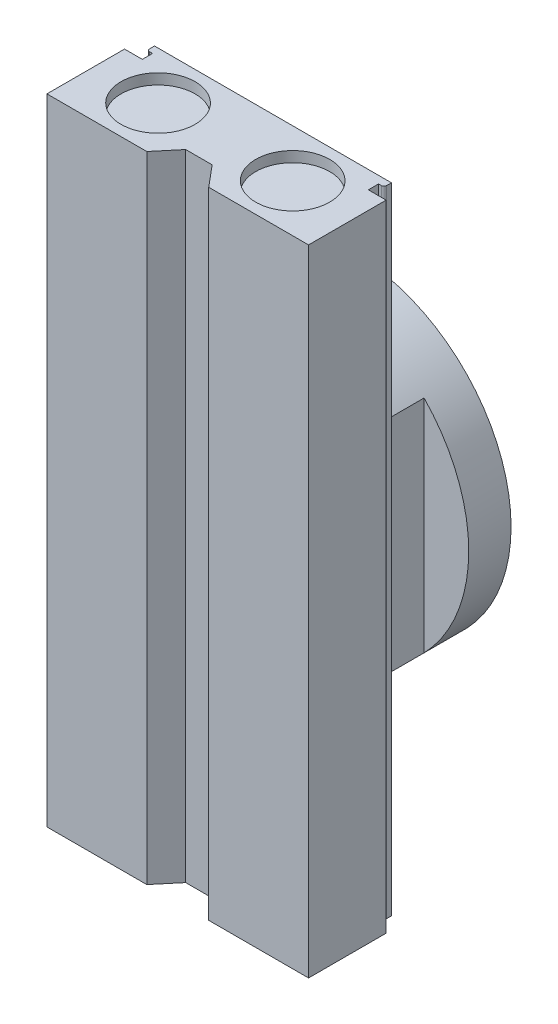
ISO-10303-21;
HEADER;
FILE_DESCRIPTION(('STEP AP214'),'2;1');
FILE_NAME('part.step','',(''),(''),'','','');
FILE_SCHEMA(('AUTOMOTIVE_DESIGN { 1 0 10303 214 1 1 1 1 }'));
ENDSEC;
DATA;
#1=APPLICATION_CONTEXT('core data for automotive mechanical design processes');
#2=APPLICATION_PROTOCOL_DEFINITION('international standard','automotive_design',2000,#1);
#3=PRODUCT_CONTEXT('',#1,'mechanical');
#4=PRODUCT('Part','Part','',(#3));
#5=PRODUCT_RELATED_PRODUCT_CATEGORY('part','',(#4));
#6=PRODUCT_DEFINITION_FORMATION('','',#4);
#7=PRODUCT_DEFINITION_CONTEXT('part definition',#1,'design');
#8=PRODUCT_DEFINITION('design','',#6,#7);
#9=PRODUCT_DEFINITION_SHAPE('','',#8);
#10=(LENGTH_UNIT() NAMED_UNIT(*) SI_UNIT(.MILLI.,.METRE.));
#11=(NAMED_UNIT(*) PLANE_ANGLE_UNIT() SI_UNIT($,.RADIAN.));
#12=(NAMED_UNIT(*) SI_UNIT($,.STERADIAN.) SOLID_ANGLE_UNIT());
#13=UNCERTAINTY_MEASURE_WITH_UNIT(LENGTH_MEASURE(1.E-05),#10,'distance_accuracy_value','');
#14=(GEOMETRIC_REPRESENTATION_CONTEXT(3) GLOBAL_UNCERTAINTY_ASSIGNED_CONTEXT((#13)) GLOBAL_UNIT_ASSIGNED_CONTEXT((#10,
#11,#12)) REPRESENTATION_CONTEXT('',''));
#15=CARTESIAN_POINT('',(0.,0.,0.));
#16=DIRECTION('',(0.,0.,1.));
#17=DIRECTION('',(1.,0.,0.));
#18=AXIS2_PLACEMENT_3D('',#15,#16,#17);
#19=CARTESIAN_POINT('',(-24.7249393998215,60.,33.));
#20=DIRECTION('',(0.,0.,1.));
#21=DIRECTION('',(1.,0.,0.));
#22=AXIS2_PLACEMENT_3D('',#19,#20,#21);
#23=PLANE('',#22);
#24=DIRECTION('',(0.,1.,0.));
#25=VECTOR('',#24,1.);
#26=CARTESIAN_POINT('',(-5.85639852470913,60.,33.));
#27=LINE('',#26,#25);
#28=CARTESIAN_POINT('',(-5.85639852470913,60.,33.));
#29=VERTEX_POINT('',#28);
#30=CARTESIAN_POINT('',(-5.85639852470913,-60.,33.));
#31=VERTEX_POINT('',#30);
#32=EDGE_CURVE('E184',#29,#31,#27,.F.);
#33=ORIENTED_EDGE('',*,*,#32,.F.);
#34=DIRECTION('',(-1.,0.,0.));
#35=VECTOR('',#34,1.);
#36=CARTESIAN_POINT('',(24.7249393998215,60.,33.));
#37=LINE('',#36,#35);
#38=CARTESIAN_POINT('',(-24.7249393998215,60.,33.));
#39=VERTEX_POINT('',#38);
#40=EDGE_CURVE('E326',#29,#39,#37,.T.);
#41=ORIENTED_EDGE('',*,*,#40,.T.);
#42=DIRECTION('',(0.,-1.,0.));
#43=VECTOR('',#42,1.);
#44=CARTESIAN_POINT('',(-24.7249393998215,-60.,33.));
#45=LINE('',#44,#43);
#46=CARTESIAN_POINT('',(-24.7249393998215,-60.,33.));
#47=VERTEX_POINT('',#46);
#48=EDGE_CURVE('E317',#39,#47,#45,.T.);
#49=ORIENTED_EDGE('',*,*,#48,.T.);
#50=DIRECTION('',(1.,0.,0.));
#51=VECTOR('',#50,1.);
#52=CARTESIAN_POINT('',(24.7249393998215,-60.,33.));
#53=LINE('',#52,#51);
#54=EDGE_CURVE('E322',#47,#31,#53,.T.);
#55=ORIENTED_EDGE('',*,*,#54,.T.);
#56=EDGE_LOOP('',(#33,#41,#49,#55));
#57=FACE_BOUND('',#56,.T.);
#58=ADVANCED_FACE('F32',(#57),#23,.T.);
#59=CARTESIAN_POINT('',(0.,0.,0.));
#60=DIRECTION('',(0.,0.,1.));
#61=DIRECTION('',(1.,0.,0.));
#62=AXIS2_PLACEMENT_3D('',#59,#60,#61);
#63=PLANE('',#62);
#64=CARTESIAN_POINT('',(0.,0.,0.));
#65=DIRECTION('',(0.,0.,1.));
#66=DIRECTION('',(1.,0.,0.));
#67=AXIS2_PLACEMENT_3D('',#64,#65,#66);
#68=CIRCLE('',#67,30.);
#69=CARTESIAN_POINT('',(30.,0.,0.));
#70=VERTEX_POINT('',#69);
#71=EDGE_CURVE('E363',#70,#70,#68,.T.);
#72=ORIENTED_EDGE('',*,*,#71,.F.);
#73=EDGE_LOOP('',(#72));
#74=FACE_BOUND('',#73,.T.);
#75=CARTESIAN_POINT('',(0.,0.,0.));
#76=DIRECTION('',(0.,0.,1.));
#77=DIRECTION('',(1.,0.,0.));
#78=AXIS2_PLACEMENT_3D('',#75,#76,#77);
#79=CIRCLE('',#78,10.);
#80=CARTESIAN_POINT('',(10.,0.,0.));
#81=VERTEX_POINT('',#80);
#82=EDGE_CURVE('E11',#81,#81,#79,.F.);
#83=ORIENTED_EDGE('',*,*,#82,.F.);
#84=EDGE_LOOP('',(#83));
#85=FACE_BOUND('',#84,.T.);
#86=ADVANCED_FACE('F448',(#74,#85),#63,.F.);
#87=CARTESIAN_POINT('',(24.7249393998215,60.,33.));
#88=DIRECTION('',(0.,-1.,0.));
#89=DIRECTION('',(1.,0.,0.));
#90=AXIS2_PLACEMENT_3D('',#87,#88,#89);
#91=PLANE('',#90);
#92=ORIENTED_EDGE('',*,*,#40,.F.);
#93=DIRECTION('',(0.64278760968654,0.,-0.766044443118977));
#94=VECTOR('',#93,1.);
#95=CARTESIAN_POINT('',(-2.50000000000001,60.,29.));
#96=LINE('',#95,#94);
#97=CARTESIAN_POINT('',(-2.5,60.,29.));
#98=VERTEX_POINT('',#97);
#99=EDGE_CURVE('E210',#98,#29,#96,.F.);
#100=ORIENTED_EDGE('',*,*,#99,.F.);
#101=DIRECTION('',(-1.,0.,0.));
#102=VECTOR('',#101,1.);
#103=CARTESIAN_POINT('',(2.5,60.,29.));
#104=LINE('',#103,#102);
#105=CARTESIAN_POINT('',(2.5,60.,29.));
#106=VERTEX_POINT('',#105);
#107=EDGE_CURVE('E188',#106,#98,#104,.T.);
#108=ORIENTED_EDGE('',*,*,#107,.F.);
#109=DIRECTION('',(-0.64278760968654,0.,-0.766044443118977));
#110=VECTOR('',#109,1.);
#111=CARTESIAN_POINT('',(13.6524250931667,60.,42.2909426709192));
#112=LINE('',#111,#110);
#113=CARTESIAN_POINT('',(5.85639852470913,60.,33.));
#114=VERTEX_POINT('',#113);
#115=EDGE_CURVE('E36',#106,#114,#112,.F.);
#116=ORIENTED_EDGE('',*,*,#115,.T.);
#117=CARTESIAN_POINT('',(24.7249393998215,60.,33.));
#118=VERTEX_POINT('',#117);
#119=EDGE_CURVE('E327',#118,#114,#37,.T.);
#120=ORIENTED_EDGE('',*,*,#119,.F.);
#121=DIRECTION('',(0.,0.,-1.));
#122=VECTOR('',#121,1.);
#123=CARTESIAN_POINT('',(24.7249393998215,60.,33.));
#124=LINE('',#123,#122);
#125=CARTESIAN_POINT('',(24.7249393998215,60.,18.3357840802705));
#126=VERTEX_POINT('',#125);
#127=EDGE_CURVE('E336',#118,#126,#124,.T.);
#128=ORIENTED_EDGE('',*,*,#127,.T.);
#129=DIRECTION('',(-1.,0.,0.));
#130=VECTOR('',#129,1.);
#131=CARTESIAN_POINT('',(24.7249393998215,60.,18.3357840802705));
#132=LINE('',#131,#130);
#133=CARTESIAN_POINT('',(21.3562483247727,60.,18.3357840802705));
#134=VERTEX_POINT('',#133);
#135=EDGE_CURVE('E252',#126,#134,#132,.T.);
#136=ORIENTED_EDGE('',*,*,#135,.T.);
#137=DIRECTION('',(0.,0.,-1.));
#138=VECTOR('',#137,1.);
#139=CARTESIAN_POINT('',(21.3562483247727,60.,18.3357840802705));
#140=LINE('',#139,#138);
#141=CARTESIAN_POINT('',(21.3562483247727,60.,16.4103549355981));
#142=VERTEX_POINT('',#141);
#143=EDGE_CURVE('E255',#134,#142,#140,.T.);
#144=ORIENTED_EDGE('',*,*,#143,.T.);
#145=DIRECTION('',(1.,0.,0.));
#146=VECTOR('',#145,1.);
#147=CARTESIAN_POINT('',(21.3562483247727,60.,16.4103549355981));
#148=LINE('',#147,#146);
#149=CARTESIAN_POINT('',(21.8895771507805,60.,16.4103549355981));
#150=VERTEX_POINT('',#149);
#151=EDGE_CURVE('E259',#142,#150,#148,.T.);
#152=ORIENTED_EDGE('',*,*,#151,.T.);
#153=CARTESIAN_POINT('',(21.8895771507805,60.,15.9103549355981));
#154=DIRECTION('',(0.,1.,0.));
#155=DIRECTION('',(0.,0.,-1.));
#156=AXIS2_PLACEMENT_3D('',#153,#154,#155);
#157=CIRCLE('',#156,0.5);
#158=CARTESIAN_POINT('',(22.3895771507805,60.,15.9103549355981));
#159=VERTEX_POINT('',#158);
#160=EDGE_CURVE('E262',#150,#159,#157,.T.);
#161=ORIENTED_EDGE('',*,*,#160,.T.);
#162=DIRECTION('',(0.,0.,-1.));
#163=VECTOR('',#162,1.);
#164=CARTESIAN_POINT('',(22.3895771507805,60.,15.9103549355981));
#165=LINE('',#164,#163);
#166=CARTESIAN_POINT('',(22.3895771507805,60.,15.));
#167=VERTEX_POINT('',#166);
#168=EDGE_CURVE('E265',#159,#167,#165,.T.);
#169=ORIENTED_EDGE('',*,*,#168,.T.);
#170=DIRECTION('',(-1.,0.,0.));
#171=VECTOR('',#170,1.);
#172=CARTESIAN_POINT('',(24.7249393998215,60.,15.));
#173=LINE('',#172,#171);
#174=CARTESIAN_POINT('',(-22.3895771507805,60.,15.));
#175=VERTEX_POINT('',#174);
#176=EDGE_CURVE('E321',#167,#175,#173,.T.);
#177=ORIENTED_EDGE('',*,*,#176,.T.);
#178=DIRECTION('',(0.,0.,1.));
#179=VECTOR('',#178,1.);
#180=CARTESIAN_POINT('',(-22.3895771507805,60.,13.7574931850115));
#181=LINE('',#180,#179);
#182=CARTESIAN_POINT('',(-22.3895771507805,60.,15.9103549355981));
#183=VERTEX_POINT('',#182);
#184=EDGE_CURVE('E224',#175,#183,#181,.T.);
#185=ORIENTED_EDGE('',*,*,#184,.T.);
#186=CARTESIAN_POINT('',(-21.8895771507805,60.,15.9103549355981));
#187=DIRECTION('',(0.,1.,0.));
#188=DIRECTION('',(0.,0.,1.));
#189=AXIS2_PLACEMENT_3D('',#186,#187,#188);
#190=CIRCLE('',#189,0.5);
#191=CARTESIAN_POINT('',(-21.8895771507805,60.,16.4103549355981));
#192=VERTEX_POINT('',#191);
#193=EDGE_CURVE('E211',#183,#192,#190,.T.);
#194=ORIENTED_EDGE('',*,*,#193,.T.);
#195=DIRECTION('',(1.,0.,0.));
#196=VECTOR('',#195,1.);
#197=CARTESIAN_POINT('',(-21.3562483247727,60.,16.4103549355982));
#198=LINE('',#197,#196);
#199=CARTESIAN_POINT('',(-21.3562483247727,60.,16.4103549355982));
#200=VERTEX_POINT('',#199);
#201=EDGE_CURVE('E214',#192,#200,#198,.T.);
#202=ORIENTED_EDGE('',*,*,#201,.T.);
#203=DIRECTION('',(0.,0.,1.));
#204=VECTOR('',#203,1.);
#205=CARTESIAN_POINT('',(-21.3562483247727,60.,18.3357840802706));
#206=LINE('',#205,#204);
#207=CARTESIAN_POINT('',(-21.3562483247727,60.,18.3357840802706));
#208=VERTEX_POINT('',#207);
#209=EDGE_CURVE('E218',#200,#208,#206,.T.);
#210=ORIENTED_EDGE('',*,*,#209,.T.);
#211=DIRECTION('',(-1.,0.,0.));
#212=VECTOR('',#211,1.);
#213=CARTESIAN_POINT('',(-24.7249393998216,60.,18.3357840802706));
#214=LINE('',#213,#212);
#215=CARTESIAN_POINT('',(-24.7249393998215,60.,18.3357840802706));
#216=VERTEX_POINT('',#215);
#217=EDGE_CURVE('E221',#208,#216,#214,.T.);
#218=ORIENTED_EDGE('',*,*,#217,.T.);
#219=DIRECTION('',(0.,0.,-1.));
#220=VECTOR('',#219,1.);
#221=CARTESIAN_POINT('',(-24.7249393998215,60.,33.));
#222=LINE('',#221,#220);
#223=EDGE_CURVE('E330',#39,#216,#222,.T.);
#224=ORIENTED_EDGE('',*,*,#223,.F.);
#225=EDGE_LOOP('',(#92,#100,#108,#116,#120,#128,#136,#144,#152,#161,#169,#177,#185,#194,#202,
#210,#218,#224));
#226=FACE_BOUND('',#225,.T.);
#227=CARTESIAN_POINT('',(12.7249393998215,60.,24.));
#228=DIRECTION('',(0.,-1.,0.));
#229=DIRECTION('',(0.,0.,-1.));
#230=AXIS2_PLACEMENT_3D('',#227,#228,#229);
#231=CIRCLE('',#230,7.);
#232=CARTESIAN_POINT('',(12.7249393998215,60.,17.));
#233=VERTEX_POINT('',#232);
#234=EDGE_CURVE('E296',#233,#233,#231,.T.);
#235=ORIENTED_EDGE('',*,*,#234,.T.);
#236=EDGE_LOOP('',(#235));
#237=FACE_BOUND('',#236,.T.);
#238=CARTESIAN_POINT('',(-12.7249393998215,60.,24.));
#239=DIRECTION('',(0.,-1.,0.));
#240=DIRECTION('',(0.,0.,-1.));
#241=AXIS2_PLACEMENT_3D('',#238,#239,#240);
#242=CIRCLE('',#241,7.);
#243=CARTESIAN_POINT('',(-12.7249393998215,60.,17.));
#244=VERTEX_POINT('',#243);
#245=EDGE_CURVE('E284',#244,#244,#242,.T.);
#246=ORIENTED_EDGE('',*,*,#245,.T.);
#247=EDGE_LOOP('',(#246));
#248=FACE_BOUND('',#247,.T.);
#249=ADVANCED_FACE('F390',(#226,#237,#248),#91,.F.);
#250=CARTESIAN_POINT('',(0.,0.,15.));
#251=DIRECTION('',(0.,0.,-1.));
#252=DIRECTION('',(-1.,0.,0.));
#253=AXIS2_PLACEMENT_3D('',#250,#251,#252);
#254=CYLINDRICAL_SURFACE('',#253,30.);
#255=CARTESIAN_POINT('',(0.,0.,15.));
#256=DIRECTION('',(0.,0.,1.));
#257=DIRECTION('',(1.,0.,0.));
#258=AXIS2_PLACEMENT_3D('',#255,#256,#257);
#259=CIRCLE('',#258,30.);
#260=CARTESIAN_POINT('',(-21.5599763803757,-20.8606667793156,15.));
#261=VERTEX_POINT('',#260);
#262=CARTESIAN_POINT('',(21.5599763803757,-20.8606667793156,15.));
#263=VERTEX_POINT('',#262);
#264=EDGE_CURVE('E367',#261,#263,#259,.T.);
#265=ORIENTED_EDGE('',*,*,#264,.F.);
#266=DIRECTION('',(0.,0.,-1.));
#267=VECTOR('',#266,1.);
#268=CARTESIAN_POINT('',(-21.5599763803757,-20.8606667793156,15.));
#269=LINE('',#268,#267);
#270=CARTESIAN_POINT('',(-21.5599763803757,-20.8606667793156,8.));
#271=VERTEX_POINT('',#270);
#272=EDGE_CURVE('E351',#261,#271,#269,.T.);
#273=ORIENTED_EDGE('',*,*,#272,.T.);
#274=CARTESIAN_POINT('',(0.,0.,8.));
#275=DIRECTION('',(0.,0.,1.));
#276=DIRECTION('',(1.,0.,0.));
#277=AXIS2_PLACEMENT_3D('',#274,#275,#276);
#278=CIRCLE('',#277,30.);
#279=CARTESIAN_POINT('',(-21.5599763803757,20.8606667793156,8.));
#280=VERTEX_POINT('',#279);
#281=EDGE_CURVE('E377',#280,#271,#278,.T.);
#282=ORIENTED_EDGE('',*,*,#281,.F.);
#283=DIRECTION('',(0.,0.,-1.));
#284=VECTOR('',#283,1.);
#285=CARTESIAN_POINT('',(-21.5599763803757,20.8606667793156,15.));
#286=LINE('',#285,#284);
#287=CARTESIAN_POINT('',(-21.5599763803757,20.8606667793156,15.));
#288=VERTEX_POINT('',#287);
#289=EDGE_CURVE('E348',#280,#288,#286,.F.);
#290=ORIENTED_EDGE('',*,*,#289,.T.);
#291=CARTESIAN_POINT('',(21.5599763803757,20.8606667793156,15.));
#292=VERTEX_POINT('',#291);
#293=EDGE_CURVE('E364',#292,#288,#259,.T.);
#294=ORIENTED_EDGE('',*,*,#293,.F.);
#295=DIRECTION('',(0.,0.,-1.));
#296=VECTOR('',#295,1.);
#297=CARTESIAN_POINT('',(21.5599763803757,20.8606667793156,15.));
#298=LINE('',#297,#296);
#299=CARTESIAN_POINT('',(21.5599763803757,20.8606667793156,8.));
#300=VERTEX_POINT('',#299);
#301=EDGE_CURVE('E360',#292,#300,#298,.T.);
#302=ORIENTED_EDGE('',*,*,#301,.T.);
#303=CARTESIAN_POINT('',(0.,0.,8.));
#304=DIRECTION('',(0.,0.,1.));
#305=DIRECTION('',(1.,0.,0.));
#306=AXIS2_PLACEMENT_3D('',#303,#304,#305);
#307=CIRCLE('',#306,30.);
#308=CARTESIAN_POINT('',(21.5599763803757,-20.8606667793156,8.));
#309=VERTEX_POINT('',#308);
#310=EDGE_CURVE('E372',#309,#300,#307,.T.);
#311=ORIENTED_EDGE('',*,*,#310,.F.);
#312=DIRECTION('',(0.,0.,-1.));
#313=VECTOR('',#312,1.);
#314=CARTESIAN_POINT('',(21.5599763803757,-20.8606667793156,15.));
#315=LINE('',#314,#313);
#316=EDGE_CURVE('E357',#309,#263,#315,.F.);
#317=ORIENTED_EDGE('',*,*,#316,.T.);
#318=EDGE_LOOP('',(#265,#273,#282,#290,#294,#302,#311,#317));
#319=FACE_BOUND('',#318,.T.);
#320=ORIENTED_EDGE('',*,*,#71,.T.);
#321=EDGE_LOOP('',(#320));
#322=FACE_BOUND('',#321,.T.);
#323=ADVANCED_FACE('F487',(#319,#322),#254,.T.);
#324=CARTESIAN_POINT('',(21.5599763803757,-26.8777185439,8.));
#325=DIRECTION('',(0.,0.,1.));
#326=DIRECTION('',(1.,0.,0.));
#327=AXIS2_PLACEMENT_3D('',#324,#325,#326);
#328=PLANE('',#327);
#329=ORIENTED_EDGE('',*,*,#310,.T.);
#330=DIRECTION('',(0.,-1.,0.));
#331=VECTOR('',#330,1.);
#332=CARTESIAN_POINT('',(21.5599763803757,26.1841000008317,8.));
#333=LINE('',#332,#331);
#334=EDGE_CURVE('E354',#300,#309,#333,.T.);
#335=ORIENTED_EDGE('',*,*,#334,.T.);
#336=EDGE_LOOP('',(#329,#335));
#337=FACE_BOUND('',#336,.T.);
#338=ADVANCED_FACE('F484',(#337),#328,.T.);
#339=CARTESIAN_POINT('',(21.5599763803757,26.1841000008317,8.));
#340=DIRECTION('',(-1.,0.,0.));
#341=DIRECTION('',(0.,-1.,0.));
#342=AXIS2_PLACEMENT_3D('',#339,#340,#341);
#343=PLANE('',#342);
#344=DIRECTION('',(0.,-1.,0.));
#345=VECTOR('',#344,1.);
#346=CARTESIAN_POINT('',(21.5599763803757,0.,15.));
#347=LINE('',#346,#345);
#348=EDGE_CURVE('E366',#292,#263,#347,.T.);
#349=ORIENTED_EDGE('',*,*,#348,.T.);
#350=ORIENTED_EDGE('',*,*,#316,.F.);
#351=ORIENTED_EDGE('',*,*,#334,.F.);
#352=ORIENTED_EDGE('',*,*,#301,.F.);
#353=EDGE_LOOP('',(#349,#350,#351,#352));
#354=FACE_BOUND('',#353,.T.);
#355=ADVANCED_FACE('F479',(#354),#343,.F.);
#356=CARTESIAN_POINT('',(-30.9008162630705,26.1841000008317,8.));
#357=DIRECTION('',(0.,0.,1.));
#358=DIRECTION('',(1.,0.,0.));
#359=AXIS2_PLACEMENT_3D('',#356,#357,#358);
#360=PLANE('',#359);
#361=ORIENTED_EDGE('',*,*,#281,.T.);
#362=DIRECTION('',(0.,1.,0.));
#363=VECTOR('',#362,1.);
#364=CARTESIAN_POINT('',(-21.5599763803757,26.1841000008317,8.));
#365=LINE('',#364,#363);
#366=EDGE_CURVE('E345',#271,#280,#365,.T.);
#367=ORIENTED_EDGE('',*,*,#366,.T.);
#368=EDGE_LOOP('',(#361,#367));
#369=FACE_BOUND('',#368,.T.);
#370=ADVANCED_FACE('F475',(#369),#360,.T.);
#371=CARTESIAN_POINT('',(-21.5599763803757,26.1841000008317,8.));
#372=DIRECTION('',(1.,0.,0.));
#373=DIRECTION('',(0.,1.,0.));
#374=AXIS2_PLACEMENT_3D('',#371,#372,#373);
#375=PLANE('',#374);
#376=DIRECTION('',(0.,1.,0.));
#377=VECTOR('',#376,1.);
#378=CARTESIAN_POINT('',(-21.5599763803757,0.,15.));
#379=LINE('',#378,#377);
#380=EDGE_CURVE('E374',#261,#288,#379,.T.);
#381=ORIENTED_EDGE('',*,*,#380,.T.);
#382=ORIENTED_EDGE('',*,*,#289,.F.);
#383=ORIENTED_EDGE('',*,*,#366,.F.);
#384=ORIENTED_EDGE('',*,*,#272,.F.);
#385=EDGE_LOOP('',(#381,#382,#383,#384));
#386=FACE_BOUND('',#385,.T.);
#387=ADVANCED_FACE('F478',(#386),#375,.F.);
#388=CARTESIAN_POINT('',(-24.7249393998215,60.,15.));
#389=DIRECTION('',(0.,0.,1.));
#390=DIRECTION('',(1.,0.,0.));
#391=AXIS2_PLACEMENT_3D('',#388,#389,#390);
#392=PLANE('',#391);
#393=DIRECTION('',(1.,0.,0.));
#394=VECTOR('',#393,1.);
#395=CARTESIAN_POINT('',(24.7249393998215,-60.,15.));
#396=LINE('',#395,#394);
#397=CARTESIAN_POINT('',(-22.3895771507805,-60.,15.));
#398=VERTEX_POINT('',#397);
#399=CARTESIAN_POINT('',(22.3895771507805,-60.,15.));
#400=VERTEX_POINT('',#399);
#401=EDGE_CURVE('E314',#398,#400,#396,.T.);
#402=ORIENTED_EDGE('',*,*,#401,.F.);
#403=DIRECTION('',(0.,1.,0.));
#404=VECTOR('',#403,1.);
#405=CARTESIAN_POINT('',(-22.3895771507805,60.,15.));
#406=LINE('',#405,#404);
#407=EDGE_CURVE('E248',#398,#175,#406,.T.);
#408=ORIENTED_EDGE('',*,*,#407,.T.);
#409=ORIENTED_EDGE('',*,*,#176,.F.);
#410=DIRECTION('',(0.,-1.,0.));
#411=VECTOR('',#410,1.);
#412=CARTESIAN_POINT('',(22.3895771507805,60.,15.));
#413=LINE('',#412,#411);
#414=EDGE_CURVE('E281',#167,#400,#413,.T.);
#415=ORIENTED_EDGE('',*,*,#414,.T.);
#416=EDGE_LOOP('',(#402,#408,#409,#415));
#417=FACE_BOUND('',#416,.T.);
#418=ORIENTED_EDGE('',*,*,#264,.T.);
#419=ORIENTED_EDGE('',*,*,#348,.F.);
#420=ORIENTED_EDGE('',*,*,#293,.T.);
#421=ORIENTED_EDGE('',*,*,#380,.F.);
#422=EDGE_LOOP('',(#418,#419,#420,#421));
#423=FACE_BOUND('',#422,.T.);
#424=ADVANCED_FACE('F421',(#417,#423),#392,.F.);
#425=CARTESIAN_POINT('',(-24.7249393998215,-60.,33.));
#426=DIRECTION('',(1.,0.,0.));
#427=DIRECTION('',(0.,1.,0.));
#428=AXIS2_PLACEMENT_3D('',#425,#426,#427);
#429=PLANE('',#428);
#430=ORIENTED_EDGE('',*,*,#223,.T.);
#431=DIRECTION('',(0.,-1.,0.));
#432=VECTOR('',#431,1.);
#433=CARTESIAN_POINT('',(-24.7249393998215,-60.,18.3357840802706));
#434=LINE('',#433,#432);
#435=CARTESIAN_POINT('',(-24.7249393998216,-60.,18.3357840802706));
#436=VERTEX_POINT('',#435);
#437=EDGE_CURVE('E239',#216,#436,#434,.T.);
#438=ORIENTED_EDGE('',*,*,#437,.T.);
#439=DIRECTION('',(0.,0.,-1.));
#440=VECTOR('',#439,1.);
#441=CARTESIAN_POINT('',(-24.7249393998215,-60.,33.));
#442=LINE('',#441,#440);
#443=EDGE_CURVE('E342',#47,#436,#442,.T.);
#444=ORIENTED_EDGE('',*,*,#443,.F.);
#445=ORIENTED_EDGE('',*,*,#48,.F.);
#446=EDGE_LOOP('',(#430,#438,#444,#445));
#447=FACE_BOUND('',#446,.T.);
#448=ADVANCED_FACE('F444',(#447),#429,.F.);
#449=CARTESIAN_POINT('',(24.7249393998215,-60.,33.));
#450=DIRECTION('',(0.,1.,0.));
#451=DIRECTION('',(-1.,0.,0.));
#452=AXIS2_PLACEMENT_3D('',#449,#450,#451);
#453=PLANE('',#452);
#454=CARTESIAN_POINT('',(-12.7249393998215,-60.,24.));
#455=DIRECTION('',(0.,-1.,0.));
#456=DIRECTION('',(0.,0.,-1.));
#457=AXIS2_PLACEMENT_3D('',#454,#455,#456);
#458=CIRCLE('',#457,7.);
#459=CARTESIAN_POINT('',(-12.7249393998215,-60.,17.));
#460=VERTEX_POINT('',#459);
#461=EDGE_CURVE('E302',#460,#460,#458,.T.);
#462=ORIENTED_EDGE('',*,*,#461,.F.);
#463=EDGE_LOOP('',(#462));
#464=FACE_BOUND('',#463,.T.);
#465=CARTESIAN_POINT('',(12.7249393998215,-60.,24.));
#466=DIRECTION('',(0.,-1.,0.));
#467=DIRECTION('',(0.,0.,-1.));
#468=AXIS2_PLACEMENT_3D('',#465,#466,#467);
#469=CIRCLE('',#468,7.);
#470=CARTESIAN_POINT('',(12.7249393998215,-60.,17.));
#471=VERTEX_POINT('',#470);
#472=EDGE_CURVE('E308',#471,#471,#469,.T.);
#473=ORIENTED_EDGE('',*,*,#472,.F.);
#474=EDGE_LOOP('',(#473));
#475=FACE_BOUND('',#474,.T.);
#476=DIRECTION('',(1.,0.,0.));
#477=VECTOR('',#476,1.);
#478=CARTESIAN_POINT('',(2.5,-60.,29.));
#479=LINE('',#478,#477);
#480=CARTESIAN_POINT('',(-2.5,-60.,29.));
#481=VERTEX_POINT('',#480);
#482=CARTESIAN_POINT('',(2.5,-60.,29.));
#483=VERTEX_POINT('',#482);
#484=EDGE_CURVE('E194',#481,#483,#479,.T.);
#485=ORIENTED_EDGE('',*,*,#484,.F.);
#486=DIRECTION('',(0.64278760968654,0.,-0.766044443118977));
#487=VECTOR('',#486,1.);
#488=CARTESIAN_POINT('',(6.77907363695058,-60.,17.941630657218));
#489=LINE('',#488,#487);
#490=EDGE_CURVE('E178',#481,#31,#489,.F.);
#491=ORIENTED_EDGE('',*,*,#490,.T.);
#492=ORIENTED_EDGE('',*,*,#54,.F.);
#493=ORIENTED_EDGE('',*,*,#443,.T.);
#494=DIRECTION('',(-1.,0.,0.));
#495=VECTOR('',#494,1.);
#496=CARTESIAN_POINT('',(-24.7249393998216,-60.,18.3357840802706));
#497=LINE('',#496,#495);
#498=CARTESIAN_POINT('',(-21.3562483247727,-60.,18.3357840802706));
#499=VERTEX_POINT('',#498);
#500=EDGE_CURVE('E215',#499,#436,#497,.T.);
#501=ORIENTED_EDGE('',*,*,#500,.F.);
#502=DIRECTION('',(0.,0.,1.));
#503=VECTOR('',#502,1.);
#504=CARTESIAN_POINT('',(-21.3562483247727,-60.,18.3357840802706));
#505=LINE('',#504,#503);
#506=CARTESIAN_POINT('',(-21.3562483247727,-60.,16.4103549355982));
#507=VERTEX_POINT('',#506);
#508=EDGE_CURVE('E232',#507,#499,#505,.T.);
#509=ORIENTED_EDGE('',*,*,#508,.F.);
#510=DIRECTION('',(1.,0.,0.));
#511=VECTOR('',#510,1.);
#512=CARTESIAN_POINT('',(-21.3562483247727,-60.,16.4103549355982));
#513=LINE('',#512,#511);
#514=CARTESIAN_POINT('',(-21.8895771507805,-60.,16.4103549355981));
#515=VERTEX_POINT('',#514);
#516=EDGE_CURVE('E229',#515,#507,#513,.T.);
#517=ORIENTED_EDGE('',*,*,#516,.F.);
#518=CARTESIAN_POINT('',(-21.8895771507805,-60.,15.9103549355981));
#519=DIRECTION('',(0.,1.,0.));
#520=DIRECTION('',(0.,0.,1.));
#521=AXIS2_PLACEMENT_3D('',#518,#519,#520);
#522=CIRCLE('',#521,0.5);
#523=CARTESIAN_POINT('',(-22.3895771507805,-60.,15.9103549355981));
#524=VERTEX_POINT('',#523);
#525=EDGE_CURVE('E209',#524,#515,#522,.T.);
#526=ORIENTED_EDGE('',*,*,#525,.F.);
#527=DIRECTION('',(0.,0.,-1.));
#528=VECTOR('',#527,1.);
#529=CARTESIAN_POINT('',(-22.3895771507805,-60.,33.));
#530=LINE('',#529,#528);
#531=EDGE_CURVE('E42',#524,#398,#530,.T.);
#532=ORIENTED_EDGE('',*,*,#531,.T.);
#533=ORIENTED_EDGE('',*,*,#401,.T.);
#534=DIRECTION('',(0.,0.,-1.));
#535=VECTOR('',#534,1.);
#536=CARTESIAN_POINT('',(22.3895771507805,-60.,15.9103549355981));
#537=LINE('',#536,#535);
#538=CARTESIAN_POINT('',(22.3895771507805,-60.,15.9103549355981));
#539=VERTEX_POINT('',#538);
#540=EDGE_CURVE('E256',#539,#400,#537,.T.);
#541=ORIENTED_EDGE('',*,*,#540,.F.);
#542=CARTESIAN_POINT('',(21.8895771507805,-60.,15.9103549355981));
#543=DIRECTION('',(0.,1.,0.));
#544=DIRECTION('',(0.,0.,-1.));
#545=AXIS2_PLACEMENT_3D('',#542,#543,#544);
#546=CIRCLE('',#545,0.5);
#547=CARTESIAN_POINT('',(21.8895771507805,-60.,16.4103549355981));
#548=VERTEX_POINT('',#547);
#549=EDGE_CURVE('E276',#548,#539,#546,.T.);
#550=ORIENTED_EDGE('',*,*,#549,.F.);
#551=DIRECTION('',(1.,0.,0.));
#552=VECTOR('',#551,1.);
#553=CARTESIAN_POINT('',(21.3562483247727,-60.,16.4103549355981));
#554=LINE('',#553,#552);
#555=CARTESIAN_POINT('',(21.3562483247727,-60.,16.4103549355981));
#556=VERTEX_POINT('',#555);
#557=EDGE_CURVE('E273',#556,#548,#554,.T.);
#558=ORIENTED_EDGE('',*,*,#557,.F.);
#559=DIRECTION('',(0.,0.,-1.));
#560=VECTOR('',#559,1.);
#561=CARTESIAN_POINT('',(21.3562483247727,-60.,18.3357840802705));
#562=LINE('',#561,#560);
#563=CARTESIAN_POINT('',(21.3562483247727,-60.,18.3357840802705));
#564=VERTEX_POINT('',#563);
#565=EDGE_CURVE('E270',#564,#556,#562,.T.);
#566=ORIENTED_EDGE('',*,*,#565,.F.);
#567=DIRECTION('',(-1.,0.,0.));
#568=VECTOR('',#567,1.);
#569=CARTESIAN_POINT('',(24.7249393998215,-60.,18.3357840802705));
#570=LINE('',#569,#568);
#571=CARTESIAN_POINT('',(24.7249393998215,-60.,18.3357840802705));
#572=VERTEX_POINT('',#571);
#573=EDGE_CURVE('E251',#572,#564,#570,.T.);
#574=ORIENTED_EDGE('',*,*,#573,.F.);
#575=DIRECTION('',(0.,0.,-1.));
#576=VECTOR('',#575,1.);
#577=CARTESIAN_POINT('',(24.7249393998215,-60.,33.));
#578=LINE('',#577,#576);
#579=CARTESIAN_POINT('',(24.7249393998215,-60.,33.));
#580=VERTEX_POINT('',#579);
#581=EDGE_CURVE('E339',#580,#572,#578,.T.);
#582=ORIENTED_EDGE('',*,*,#581,.F.);
#583=CARTESIAN_POINT('',(5.85639852470913,-60.,33.));
#584=VERTEX_POINT('',#583);
#585=EDGE_CURVE('E320',#584,#580,#53,.T.);
#586=ORIENTED_EDGE('',*,*,#585,.F.);
#587=DIRECTION('',(-0.64278760968654,0.,-0.766044443118977));
#588=VECTOR('',#587,1.);
#589=CARTESIAN_POINT('',(2.5,-60.,29.));
#590=LINE('',#589,#588);
#591=EDGE_CURVE('E50',#483,#584,#590,.F.);
#592=ORIENTED_EDGE('',*,*,#591,.F.);
#593=EDGE_LOOP('',(#485,#491,#492,#493,#501,#509,#517,#526,#532,#533,#541,#550,#558,#566,#574,
#582,#586,#592));
#594=FACE_BOUND('',#593,.T.);
#595=ADVANCED_FACE('F199',(#464,#475,#594),#453,.F.);
#596=CARTESIAN_POINT('',(24.7249393998215,-60.,33.));
#597=DIRECTION('',(-1.,0.,0.));
#598=DIRECTION('',(0.,0.,1.));
#599=AXIS2_PLACEMENT_3D('',#596,#597,#598);
#600=PLANE('',#599);
#601=ORIENTED_EDGE('',*,*,#581,.T.);
#602=DIRECTION('',(0.,1.,0.));
#603=VECTOR('',#602,1.);
#604=CARTESIAN_POINT('',(24.7249393998215,-60.,18.3357840802705));
#605=LINE('',#604,#603);
#606=EDGE_CURVE('E379',#572,#126,#605,.T.);
#607=ORIENTED_EDGE('',*,*,#606,.T.);
#608=ORIENTED_EDGE('',*,*,#127,.F.);
#609=DIRECTION('',(0.,1.,0.));
#610=VECTOR('',#609,1.);
#611=CARTESIAN_POINT('',(24.7249393998215,-60.,33.));
#612=LINE('',#611,#610);
#613=EDGE_CURVE('E324',#580,#118,#612,.T.);
#614=ORIENTED_EDGE('',*,*,#613,.F.);
#615=EDGE_LOOP('',(#601,#607,#608,#614));
#616=FACE_BOUND('',#615,.T.);
#617=ADVANCED_FACE('F398',(#616),#600,.F.);
#618=DIRECTION('',(0.,-1.,0.));
#619=VECTOR('',#618,1.);
#620=CARTESIAN_POINT('',(5.85639852470913,60.,33.));
#621=LINE('',#620,#619);
#622=EDGE_CURVE('E197',#584,#114,#621,.F.);
#623=ORIENTED_EDGE('',*,*,#622,.F.);
#624=ORIENTED_EDGE('',*,*,#585,.T.);
#625=ORIENTED_EDGE('',*,*,#613,.T.);
#626=ORIENTED_EDGE('',*,*,#119,.T.);
#627=EDGE_LOOP('',(#623,#624,#625,#626));
#628=FACE_BOUND('',#627,.T.);
#629=ADVANCED_FACE('F393',(#628),#23,.T.);
#630=CARTESIAN_POINT('',(12.7249393998215,-58.,24.));
#631=DIRECTION('',(0.,-1.,0.));
#632=DIRECTION('',(0.,0.,-1.));
#633=AXIS2_PLACEMENT_3D('',#630,#631,#632);
#634=CYLINDRICAL_SURFACE('',#633,7.);
#635=CARTESIAN_POINT('',(12.7249393998215,-58.,24.));
#636=DIRECTION('',(0.,-1.,0.));
#637=DIRECTION('',(0.,0.,-1.));
#638=AXIS2_PLACEMENT_3D('',#635,#636,#637);
#639=CIRCLE('',#638,7.);
#640=CARTESIAN_POINT('',(12.7249393998215,-58.,17.));
#641=VERTEX_POINT('',#640);
#642=EDGE_CURVE('E311',#641,#641,#639,.T.);
#643=ORIENTED_EDGE('',*,*,#642,.F.);
#644=EDGE_LOOP('',(#643));
#645=FACE_BOUND('',#644,.T.);
#646=ORIENTED_EDGE('',*,*,#472,.T.);
#647=EDGE_LOOP('',(#646));
#648=FACE_BOUND('',#647,.T.);
#649=ADVANCED_FACE('F458',(#645,#648),#634,.F.);
#650=CARTESIAN_POINT('',(12.7249393998215,-58.,24.));
#651=DIRECTION('',(0.,-1.,0.));
#652=DIRECTION('',(0.,0.,-1.));
#653=AXIS2_PLACEMENT_3D('',#650,#651,#652);
#654=PLANE('',#653);
#655=ORIENTED_EDGE('',*,*,#642,.T.);
#656=EDGE_LOOP('',(#655));
#657=FACE_BOUND('',#656,.T.);
#658=ADVANCED_FACE('F463',(#657),#654,.T.);
#659=CARTESIAN_POINT('',(-12.7249393998215,-58.,24.));
#660=DIRECTION('',(0.,-1.,0.));
#661=DIRECTION('',(0.,0.,-1.));
#662=AXIS2_PLACEMENT_3D('',#659,#660,#661);
#663=CYLINDRICAL_SURFACE('',#662,7.);
#664=CARTESIAN_POINT('',(-12.7249393998215,-58.,24.));
#665=DIRECTION('',(0.,-1.,0.));
#666=DIRECTION('',(0.,0.,-1.));
#667=AXIS2_PLACEMENT_3D('',#664,#665,#666);
#668=CIRCLE('',#667,7.);
#669=CARTESIAN_POINT('',(-12.7249393998215,-58.,17.));
#670=VERTEX_POINT('',#669);
#671=EDGE_CURVE('E305',#670,#670,#668,.T.);
#672=ORIENTED_EDGE('',*,*,#671,.F.);
#673=EDGE_LOOP('',(#672));
#674=FACE_BOUND('',#673,.T.);
#675=ORIENTED_EDGE('',*,*,#461,.T.);
#676=EDGE_LOOP('',(#675));
#677=FACE_BOUND('',#676,.T.);
#678=ADVANCED_FACE('F549',(#674,#677),#663,.F.);
#679=CARTESIAN_POINT('',(-12.7249393998215,-58.,24.));
#680=DIRECTION('',(0.,-1.,0.));
#681=DIRECTION('',(0.,0.,-1.));
#682=AXIS2_PLACEMENT_3D('',#679,#680,#681);
#683=PLANE('',#682);
#684=ORIENTED_EDGE('',*,*,#671,.T.);
#685=EDGE_LOOP('',(#684));
#686=FACE_BOUND('',#685,.T.);
#687=ADVANCED_FACE('F545',(#686),#683,.T.);
#688=CARTESIAN_POINT('',(12.7249393998215,58.,24.));
#689=DIRECTION('',(0.,1.,0.));
#690=DIRECTION('',(0.,0.,1.));
#691=AXIS2_PLACEMENT_3D('',#688,#689,#690);
#692=CYLINDRICAL_SURFACE('',#691,7.);
#693=CARTESIAN_POINT('',(12.7249393998215,58.,24.));
#694=DIRECTION('',(0.,-1.,0.));
#695=DIRECTION('',(0.,0.,-1.));
#696=AXIS2_PLACEMENT_3D('',#693,#694,#695);
#697=CIRCLE('',#696,7.);
#698=CARTESIAN_POINT('',(12.7249393998215,58.,17.));
#699=VERTEX_POINT('',#698);
#700=EDGE_CURVE('E299',#699,#699,#697,.T.);
#701=ORIENTED_EDGE('',*,*,#700,.T.);
#702=EDGE_LOOP('',(#701));
#703=FACE_BOUND('',#702,.T.);
#704=ORIENTED_EDGE('',*,*,#234,.F.);
#705=EDGE_LOOP('',(#704));
#706=FACE_BOUND('',#705,.T.);
#707=ADVANCED_FACE('F541',(#703,#706),#692,.F.);
#708=CARTESIAN_POINT('',(12.7249393998215,58.,24.));
#709=DIRECTION('',(0.,1.,0.));
#710=DIRECTION('',(0.,0.,-1.));
#711=AXIS2_PLACEMENT_3D('',#708,#709,#710);
#712=PLANE('',#711);
#713=ORIENTED_EDGE('',*,*,#700,.F.);
#714=EDGE_LOOP('',(#713));
#715=FACE_BOUND('',#714,.T.);
#716=ADVANCED_FACE('F537',(#715),#712,.T.);
#717=CARTESIAN_POINT('',(-12.7249393998215,58.,24.));
#718=DIRECTION('',(0.,1.,0.));
#719=DIRECTION('',(0.,0.,1.));
#720=AXIS2_PLACEMENT_3D('',#717,#718,#719);
#721=CYLINDRICAL_SURFACE('',#720,7.);
#722=CARTESIAN_POINT('',(-12.7249393998215,58.,24.));
#723=DIRECTION('',(0.,-1.,0.));
#724=DIRECTION('',(0.,0.,-1.));
#725=AXIS2_PLACEMENT_3D('',#722,#723,#724);
#726=CIRCLE('',#725,7.);
#727=CARTESIAN_POINT('',(-12.7249393998215,58.,17.));
#728=VERTEX_POINT('',#727);
#729=EDGE_CURVE('E293',#728,#728,#726,.T.);
#730=ORIENTED_EDGE('',*,*,#729,.T.);
#731=EDGE_LOOP('',(#730));
#732=FACE_BOUND('',#731,.T.);
#733=ORIENTED_EDGE('',*,*,#245,.F.);
#734=EDGE_LOOP('',(#733));
#735=FACE_BOUND('',#734,.T.);
#736=ADVANCED_FACE('F533',(#732,#735),#721,.F.);
#737=CARTESIAN_POINT('',(-12.7249393998215,58.,24.));
#738=DIRECTION('',(0.,1.,0.));
#739=DIRECTION('',(0.,0.,-1.));
#740=AXIS2_PLACEMENT_3D('',#737,#738,#739);
#741=PLANE('',#740);
#742=ORIENTED_EDGE('',*,*,#729,.F.);
#743=EDGE_LOOP('',(#742));
#744=FACE_BOUND('',#743,.T.);
#745=ADVANCED_FACE('F530',(#744),#741,.T.);
#746=CARTESIAN_POINT('',(24.7249393998215,60.,18.3357840802705));
#747=DIRECTION('',(0.,0.,1.));
#748=DIRECTION('',(1.,0.,0.));
#749=AXIS2_PLACEMENT_3D('',#746,#747,#748);
#750=PLANE('',#749);
#751=ORIENTED_EDGE('',*,*,#573,.T.);
#752=DIRECTION('',(0.,-1.,0.));
#753=VECTOR('',#752,1.);
#754=CARTESIAN_POINT('',(21.3562483247727,60.,18.3357840802705));
#755=LINE('',#754,#753);
#756=EDGE_CURVE('E268',#134,#564,#755,.T.);
#757=ORIENTED_EDGE('',*,*,#756,.F.);
#758=ORIENTED_EDGE('',*,*,#135,.F.);
#759=ORIENTED_EDGE('',*,*,#606,.F.);
#760=EDGE_LOOP('',(#751,#757,#758,#759));
#761=FACE_BOUND('',#760,.T.);
#762=ADVANCED_FACE('F401',(#761),#750,.F.);
#763=CARTESIAN_POINT('',(22.3895771507805,60.,15.9103549355981));
#764=DIRECTION('',(-1.,0.,0.));
#765=DIRECTION('',(0.,0.,1.));
#766=AXIS2_PLACEMENT_3D('',#763,#764,#765);
#767=PLANE('',#766);
#768=ORIENTED_EDGE('',*,*,#540,.T.);
#769=ORIENTED_EDGE('',*,*,#414,.F.);
#770=ORIENTED_EDGE('',*,*,#168,.F.);
#771=DIRECTION('',(0.,-1.,0.));
#772=VECTOR('',#771,1.);
#773=CARTESIAN_POINT('',(22.3895771507805,60.,15.9103549355981));
#774=LINE('',#773,#772);
#775=EDGE_CURVE('E285',#159,#539,#774,.T.);
#776=ORIENTED_EDGE('',*,*,#775,.T.);
#777=EDGE_LOOP('',(#768,#769,#770,#776));
#778=FACE_BOUND('',#777,.T.);
#779=ADVANCED_FACE('F418',(#778),#767,.F.);
#780=CARTESIAN_POINT('',(21.8895771507805,60.,15.9103549355981));
#781=DIRECTION('',(0.,-1.,0.));
#782=DIRECTION('',(0.,0.,-1.));
#783=AXIS2_PLACEMENT_3D('',#780,#781,#782);
#784=CYLINDRICAL_SURFACE('',#783,0.5);
#785=ORIENTED_EDGE('',*,*,#549,.T.);
#786=ORIENTED_EDGE('',*,*,#775,.F.);
#787=ORIENTED_EDGE('',*,*,#160,.F.);
#788=DIRECTION('',(0.,-1.,0.));
#789=VECTOR('',#788,1.);
#790=CARTESIAN_POINT('',(21.8895771507805,60.,16.4103549355981));
#791=LINE('',#790,#789);
#792=EDGE_CURVE('E287',#150,#548,#791,.T.);
#793=ORIENTED_EDGE('',*,*,#792,.T.);
#794=EDGE_LOOP('',(#785,#786,#787,#793));
#795=FACE_BOUND('',#794,.T.);
#796=ADVANCED_FACE('F414',(#795),#784,.T.);
#797=CARTESIAN_POINT('',(21.3562483247727,60.,16.4103549355981));
#798=DIRECTION('',(0.,0.,-1.));
#799=DIRECTION('',(-1.,0.,0.));
#800=AXIS2_PLACEMENT_3D('',#797,#798,#799);
#801=PLANE('',#800);
#802=ORIENTED_EDGE('',*,*,#557,.T.);
#803=ORIENTED_EDGE('',*,*,#792,.F.);
#804=ORIENTED_EDGE('',*,*,#151,.F.);
#805=DIRECTION('',(0.,-1.,0.));
#806=VECTOR('',#805,1.);
#807=CARTESIAN_POINT('',(21.3562483247727,60.,16.4103549355981));
#808=LINE('',#807,#806);
#809=EDGE_CURVE('E289',#142,#556,#808,.T.);
#810=ORIENTED_EDGE('',*,*,#809,.T.);
#811=EDGE_LOOP('',(#802,#803,#804,#810));
#812=FACE_BOUND('',#811,.T.);
#813=ADVANCED_FACE('F409',(#812),#801,.F.);
#814=CARTESIAN_POINT('',(21.3562483247727,60.,18.3357840802705));
#815=DIRECTION('',(-1.,0.,0.));
#816=DIRECTION('',(0.,0.,1.));
#817=AXIS2_PLACEMENT_3D('',#814,#815,#816);
#818=PLANE('',#817);
#819=ORIENTED_EDGE('',*,*,#565,.T.);
#820=ORIENTED_EDGE('',*,*,#809,.F.);
#821=ORIENTED_EDGE('',*,*,#143,.F.);
#822=ORIENTED_EDGE('',*,*,#756,.T.);
#823=EDGE_LOOP('',(#819,#820,#821,#822));
#824=FACE_BOUND('',#823,.T.);
#825=ADVANCED_FACE('F405',(#824),#818,.F.);
#826=CARTESIAN_POINT('',(-22.3895771507805,60.,15.9103549355981));
#827=DIRECTION('',(1.,0.,0.));
#828=DIRECTION('',(0.,0.,-1.));
#829=AXIS2_PLACEMENT_3D('',#826,#827,#828);
#830=PLANE('',#829);
#831=ORIENTED_EDGE('',*,*,#531,.F.);
#832=DIRECTION('',(0.,-1.,0.));
#833=VECTOR('',#832,1.);
#834=CARTESIAN_POINT('',(-22.3895771507805,60.,15.9103549355981));
#835=LINE('',#834,#833);
#836=EDGE_CURVE('E236',#183,#524,#835,.T.);
#837=ORIENTED_EDGE('',*,*,#836,.F.);
#838=ORIENTED_EDGE('',*,*,#184,.F.);
#839=ORIENTED_EDGE('',*,*,#407,.F.);
#840=EDGE_LOOP('',(#831,#837,#838,#839));
#841=FACE_BOUND('',#840,.T.);
#842=ADVANCED_FACE('F425',(#841),#830,.F.);
#843=CARTESIAN_POINT('',(-24.7249393998216,60.,18.3357840802706));
#844=DIRECTION('',(0.,0.,1.));
#845=DIRECTION('',(1.,0.,0.));
#846=AXIS2_PLACEMENT_3D('',#843,#844,#845);
#847=PLANE('',#846);
#848=ORIENTED_EDGE('',*,*,#217,.F.);
#849=DIRECTION('',(0.,-1.,0.));
#850=VECTOR('',#849,1.);
#851=CARTESIAN_POINT('',(-21.3562483247727,60.,18.3357840802706));
#852=LINE('',#851,#850);
#853=EDGE_CURVE('E240',#208,#499,#852,.T.);
#854=ORIENTED_EDGE('',*,*,#853,.T.);
#855=ORIENTED_EDGE('',*,*,#500,.T.);
#856=ORIENTED_EDGE('',*,*,#437,.F.);
#857=EDGE_LOOP('',(#848,#854,#855,#856));
#858=FACE_BOUND('',#857,.T.);
#859=ADVANCED_FACE('F441',(#858),#847,.F.);
#860=CARTESIAN_POINT('',(-21.8895771507805,60.,15.9103549355981));
#861=DIRECTION('',(0.,-1.,0.));
#862=DIRECTION('',(0.,0.,-1.));
#863=AXIS2_PLACEMENT_3D('',#860,#861,#862);
#864=CYLINDRICAL_SURFACE('',#863,0.5);
#865=ORIENTED_EDGE('',*,*,#525,.T.);
#866=DIRECTION('',(0.,-1.,0.));
#867=VECTOR('',#866,1.);
#868=CARTESIAN_POINT('',(-21.8895771507805,60.,16.4103549355981));
#869=LINE('',#868,#867);
#870=EDGE_CURVE('E227',#192,#515,#869,.T.);
#871=ORIENTED_EDGE('',*,*,#870,.F.);
#872=ORIENTED_EDGE('',*,*,#193,.F.);
#873=ORIENTED_EDGE('',*,*,#836,.T.);
#874=EDGE_LOOP('',(#865,#871,#872,#873));
#875=FACE_BOUND('',#874,.T.);
#876=ADVANCED_FACE('F428',(#875),#864,.T.);
#877=CARTESIAN_POINT('',(-21.3562483247727,60.,18.3357840802706));
#878=DIRECTION('',(1.,0.,0.));
#879=DIRECTION('',(0.,0.,-1.));
#880=AXIS2_PLACEMENT_3D('',#877,#878,#879);
#881=PLANE('',#880);
#882=ORIENTED_EDGE('',*,*,#508,.T.);
#883=ORIENTED_EDGE('',*,*,#853,.F.);
#884=ORIENTED_EDGE('',*,*,#209,.F.);
#885=DIRECTION('',(0.,-1.,0.));
#886=VECTOR('',#885,1.);
#887=CARTESIAN_POINT('',(-21.3562483247727,60.,16.4103549355982));
#888=LINE('',#887,#886);
#889=EDGE_CURVE('E242',#200,#507,#888,.T.);
#890=ORIENTED_EDGE('',*,*,#889,.T.);
#891=EDGE_LOOP('',(#882,#883,#884,#890));
#892=FACE_BOUND('',#891,.T.);
#893=ADVANCED_FACE('F437',(#892),#881,.F.);
#894=CARTESIAN_POINT('',(-21.3562483247727,60.,16.4103549355982));
#895=DIRECTION('',(0.,0.,-1.));
#896=DIRECTION('',(-1.,0.,0.));
#897=AXIS2_PLACEMENT_3D('',#894,#895,#896);
#898=PLANE('',#897);
#899=ORIENTED_EDGE('',*,*,#516,.T.);
#900=ORIENTED_EDGE('',*,*,#889,.F.);
#901=ORIENTED_EDGE('',*,*,#201,.F.);
#902=ORIENTED_EDGE('',*,*,#870,.T.);
#903=EDGE_LOOP('',(#899,#900,#901,#902));
#904=FACE_BOUND('',#903,.T.);
#905=ADVANCED_FACE('F432',(#904),#898,.F.);
#906=CARTESIAN_POINT('',(0.,0.,-10.));
#907=DIRECTION('',(0.,0.,1.));
#908=DIRECTION('',(1.,0.,0.));
#909=AXIS2_PLACEMENT_3D('',#906,#907,#908);
#910=CYLINDRICAL_SURFACE('',#909,10.);
#911=CARTESIAN_POINT('',(0.,0.,-10.));
#912=DIRECTION('',(0.,0.,-1.));
#913=DIRECTION('',(-1.,0.,0.));
#914=AXIS2_PLACEMENT_3D('',#911,#912,#913);
#915=CIRCLE('',#914,10.);
#916=CARTESIAN_POINT('',(-10.,0.,-10.));
#917=VERTEX_POINT('',#916);
#918=EDGE_CURVE('E206',#917,#917,#915,.T.);
#919=ORIENTED_EDGE('',*,*,#918,.F.);
#920=EDGE_LOOP('',(#919));
#921=FACE_BOUND('',#920,.T.);
#922=ORIENTED_EDGE('',*,*,#82,.T.);
#923=EDGE_LOOP('',(#922));
#924=FACE_BOUND('',#923,.T.);
#925=ADVANCED_FACE('F500',(#921,#924),#910,.T.);
#926=CARTESIAN_POINT('',(0.,0.,-10.));
#927=DIRECTION('',(0.,0.,-1.));
#928=DIRECTION('',(-1.,0.,0.));
#929=AXIS2_PLACEMENT_3D('',#926,#927,#928);
#930=PLANE('',#929);
#931=ORIENTED_EDGE('',*,*,#918,.T.);
#932=EDGE_LOOP('',(#931));
#933=FACE_BOUND('',#932,.T.);
#934=ADVANCED_FACE('F495',(#933),#930,.T.);
#935=CARTESIAN_POINT('',(-2.5,-60.,29.));
#936=DIRECTION('',(0.766044443118977,0.,0.64278760968654));
#937=DIRECTION('',(0.64278760968654,0.,-0.766044443118977));
#938=AXIS2_PLACEMENT_3D('',#935,#936,#937);
#939=PLANE('',#938);
#940=ORIENTED_EDGE('',*,*,#32,.T.);
#941=ORIENTED_EDGE('',*,*,#490,.F.);
#942=DIRECTION('',(0.,-1.,0.));
#943=VECTOR('',#942,1.);
#944=CARTESIAN_POINT('',(-2.5,-60.,29.));
#945=LINE('',#944,#943);
#946=EDGE_CURVE('E181',#98,#481,#945,.T.);
#947=ORIENTED_EDGE('',*,*,#946,.F.);
#948=ORIENTED_EDGE('',*,*,#99,.T.);
#949=EDGE_LOOP('',(#940,#941,#947,#948));
#950=FACE_BOUND('',#949,.T.);
#951=ADVANCED_FACE('F180',(#950),#939,.T.);
#952=CARTESIAN_POINT('',(2.5,-60.,29.));
#953=DIRECTION('',(-0.766044443118977,0.,0.64278760968654));
#954=DIRECTION('',(0.64278760968654,0.,0.766044443118977));
#955=AXIS2_PLACEMENT_3D('',#952,#953,#954);
#956=PLANE('',#955);
#957=ORIENTED_EDGE('',*,*,#622,.T.);
#958=ORIENTED_EDGE('',*,*,#115,.F.);
#959=DIRECTION('',(0.,1.,0.));
#960=VECTOR('',#959,1.);
#961=CARTESIAN_POINT('',(2.5,-60.,29.));
#962=LINE('',#961,#960);
#963=EDGE_CURVE('E201',#483,#106,#962,.T.);
#964=ORIENTED_EDGE('',*,*,#963,.F.);
#965=ORIENTED_EDGE('',*,*,#591,.T.);
#966=EDGE_LOOP('',(#957,#958,#964,#965));
#967=FACE_BOUND('',#966,.T.);
#968=ADVANCED_FACE('F34',(#967),#956,.T.);
#969=CARTESIAN_POINT('',(-2.5,60.,29.));
#970=DIRECTION('',(0.,0.,1.));
#971=DIRECTION('',(1.,0.,0.));
#972=AXIS2_PLACEMENT_3D('',#969,#970,#971);
#973=PLANE('',#972);
#974=ORIENTED_EDGE('',*,*,#946,.T.);
#975=ORIENTED_EDGE('',*,*,#484,.T.);
#976=ORIENTED_EDGE('',*,*,#963,.T.);
#977=ORIENTED_EDGE('',*,*,#107,.T.);
#978=EDGE_LOOP('',(#974,#975,#976,#977));
#979=FACE_BOUND('',#978,.T.);
#980=ADVANCED_FACE('F192',(#979),#973,.T.);
#981=CLOSED_SHELL('',(#58,#86,#249,#323,#338,#355,#370,#387,#424,#448,#595,#617,#629,#649,#658,
#678,#687,#707,#716,#736,#745,#762,#779,#796,#813,#825,#842,#859,#876,#893,#905,#925,#934,#951,
#968,#980));
#982=MANIFOLD_SOLID_BREP('B2',#981);
#983=ADVANCED_BREP_SHAPE_REPRESENTATION('',(#18,#982),#14);
#984=SHAPE_DEFINITION_REPRESENTATION(#9,#983);
ENDSEC;
END-ISO-10303-21;
